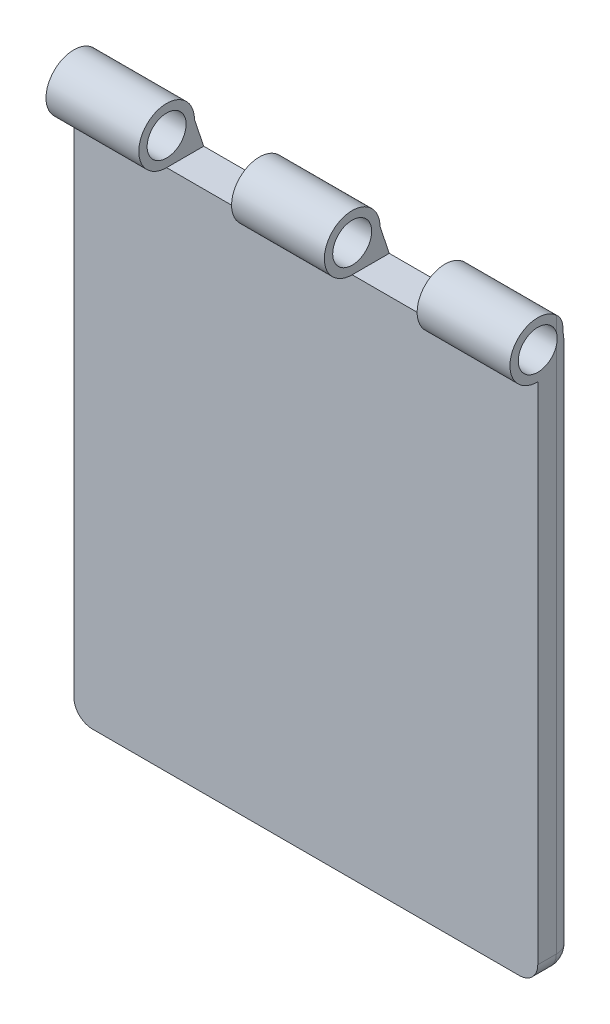
ISO-10303-21;
HEADER;
FILE_DESCRIPTION(('STEP AP214'),'2;1');
FILE_NAME('part.step','',(''),(''),'','','');
FILE_SCHEMA(('AUTOMOTIVE_DESIGN { 1 0 10303 214 1 1 1 1 }'));
ENDSEC;
DATA;
#1=APPLICATION_CONTEXT('core data for automotive mechanical design processes');
#2=APPLICATION_PROTOCOL_DEFINITION('international standard','automotive_design',2000,#1);
#3=PRODUCT_CONTEXT('',#1,'mechanical');
#4=PRODUCT('Part','Part','',(#3));
#5=PRODUCT_RELATED_PRODUCT_CATEGORY('part','',(#4));
#6=PRODUCT_DEFINITION_FORMATION('','',#4);
#7=PRODUCT_DEFINITION_CONTEXT('part definition',#1,'design');
#8=PRODUCT_DEFINITION('design','',#6,#7);
#9=PRODUCT_DEFINITION_SHAPE('','',#8);
#10=(LENGTH_UNIT() NAMED_UNIT(*) SI_UNIT(.MILLI.,.METRE.));
#11=(NAMED_UNIT(*) PLANE_ANGLE_UNIT() SI_UNIT($,.RADIAN.));
#12=(NAMED_UNIT(*) SI_UNIT($,.STERADIAN.) SOLID_ANGLE_UNIT());
#13=UNCERTAINTY_MEASURE_WITH_UNIT(LENGTH_MEASURE(1.E-05),#10,'distance_accuracy_value','');
#14=(GEOMETRIC_REPRESENTATION_CONTEXT(3) GLOBAL_UNCERTAINTY_ASSIGNED_CONTEXT((#13)) GLOBAL_UNIT_ASSIGNED_CONTEXT((#10,
#11,#12)) REPRESENTATION_CONTEXT('',''));
#15=CARTESIAN_POINT('',(0.,0.,0.));
#16=DIRECTION('',(0.,0.,1.));
#17=DIRECTION('',(1.,0.,0.));
#18=AXIS2_PLACEMENT_3D('',#15,#16,#17);
#19=CARTESIAN_POINT('',(-12.5,14.1,2.));
#20=DIRECTION('',(0.,-1.,0.));
#21=DIRECTION('',(0.,0.,-1.));
#22=AXIS2_PLACEMENT_3D('',#19,#20,#21);
#23=PLANE('',#22);
#24=DIRECTION('',(0.,0.,1.));
#25=VECTOR('',#24,1.);
#26=CARTESIAN_POINT('',(2.5,14.1,2.));
#27=LINE('',#26,#25);
#28=CARTESIAN_POINT('',(2.5,14.1,0.));
#29=VERTEX_POINT('',#28);
#30=CARTESIAN_POINT('',(2.5,14.1,2.));
#31=VERTEX_POINT('',#30);
#32=EDGE_CURVE('E185',#29,#31,#27,.T.);
#33=ORIENTED_EDGE('',*,*,#32,.T.);
#34=DIRECTION('',(-1.,0.,0.));
#35=VECTOR('',#34,1.);
#36=CARTESIAN_POINT('',(-12.5,14.1,2.));
#37=LINE('',#36,#35);
#38=CARTESIAN_POINT('',(7.5,14.1,2.));
#39=VERTEX_POINT('',#38);
#40=EDGE_CURVE('E275',#39,#31,#37,.T.);
#41=ORIENTED_EDGE('',*,*,#40,.F.);
#42=DIRECTION('',(0.,0.,1.));
#43=VECTOR('',#42,1.);
#44=CARTESIAN_POINT('',(7.5,14.1,2.));
#45=LINE('',#44,#43);
#46=CARTESIAN_POINT('',(7.5,14.1,0.));
#47=VERTEX_POINT('',#46);
#48=EDGE_CURVE('E224',#47,#39,#45,.T.);
#49=ORIENTED_EDGE('',*,*,#48,.F.);
#50=DIRECTION('',(-1.,0.,0.));
#51=VECTOR('',#50,1.);
#52=CARTESIAN_POINT('',(-12.5,14.1,0.));
#53=LINE('',#52,#51);
#54=EDGE_CURVE('E284',#47,#29,#53,.T.);
#55=ORIENTED_EDGE('',*,*,#54,.T.);
#56=EDGE_LOOP('',(#33,#41,#49,#55));
#57=FACE_BOUND('',#56,.T.);
#58=ADVANCED_FACE('F47',(#57),#23,.F.);
#59=CARTESIAN_POINT('',(-2.5,14.1,2.));
#60=VERTEX_POINT('',#59);
#61=CARTESIAN_POINT('',(-7.5,14.1,2.));
#62=VERTEX_POINT('',#61);
#63=EDGE_CURVE('E268',#60,#62,#37,.T.);
#64=ORIENTED_EDGE('',*,*,#63,.F.);
#65=DIRECTION('',(0.,0.,1.));
#66=VECTOR('',#65,1.);
#67=CARTESIAN_POINT('',(-2.5,14.1,2.));
#68=LINE('',#67,#66);
#69=CARTESIAN_POINT('',(-2.5,14.1,0.));
#70=VERTEX_POINT('',#69);
#71=EDGE_CURVE('E198',#70,#60,#68,.T.);
#72=ORIENTED_EDGE('',*,*,#71,.F.);
#73=CARTESIAN_POINT('',(-7.5,14.1,0.));
#74=VERTEX_POINT('',#73);
#75=EDGE_CURVE('E257',#70,#74,#53,.T.);
#76=ORIENTED_EDGE('',*,*,#75,.T.);
#77=DIRECTION('',(0.,0.,1.));
#78=VECTOR('',#77,1.);
#79=CARTESIAN_POINT('',(-7.5,14.1,2.));
#80=LINE('',#79,#78);
#81=EDGE_CURVE('E246',#74,#62,#80,.T.);
#82=ORIENTED_EDGE('',*,*,#81,.T.);
#83=EDGE_LOOP('',(#64,#72,#76,#82));
#84=FACE_BOUND('',#83,.T.);
#85=ADVANCED_FACE('F381',(#84),#23,.F.);
#86=CARTESIAN_POINT('',(12.5,-14.1,2.));
#87=DIRECTION('',(-1.,0.,0.));
#88=DIRECTION('',(0.,0.,1.));
#89=AXIS2_PLACEMENT_3D('',#86,#87,#88);
#90=PLANE('',#89);
#91=DIRECTION('',(0.,1.,0.));
#92=VECTOR('',#91,1.);
#93=CARTESIAN_POINT('',(12.5,-14.1,2.));
#94=LINE('',#93,#92);
#95=CARTESIAN_POINT('',(12.5,-13.1,2.));
#96=VERTEX_POINT('',#95);
#97=CARTESIAN_POINT('',(12.5,14.1,2.));
#98=VERTEX_POINT('',#97);
#99=EDGE_CURVE('E265',#96,#98,#94,.T.);
#100=ORIENTED_EDGE('',*,*,#99,.F.);
#101=DIRECTION('',(0.,0.,-1.));
#102=VECTOR('',#101,1.);
#103=CARTESIAN_POINT('',(12.5,-13.1,2.));
#104=LINE('',#103,#102);
#105=CARTESIAN_POINT('',(12.5,-13.1,1.));
#106=VERTEX_POINT('',#105);
#107=EDGE_CURVE('E474',#96,#106,#104,.T.);
#108=ORIENTED_EDGE('',*,*,#107,.T.);
#109=DIRECTION('',(0.,1.,0.));
#110=VECTOR('',#109,1.);
#111=CARTESIAN_POINT('',(12.5,14.1,1.));
#112=LINE('',#111,#110);
#113=CARTESIAN_POINT('',(12.5,15.2798436779322,1.));
#114=VERTEX_POINT('',#113);
#115=EDGE_CURVE('E293',#106,#114,#112,.T.);
#116=ORIENTED_EDGE('',*,*,#115,.T.);
#117=CARTESIAN_POINT('',(12.5,15.6,2.));
#118=DIRECTION('',(-1.,0.,0.));
#119=DIRECTION('',(0.,0.,1.));
#120=AXIS2_PLACEMENT_3D('',#117,#118,#119);
#121=CIRCLE('',#120,1.0500000336);
#122=CARTESIAN_POINT('',(12.5,15.9201563220678,1.));
#123=VERTEX_POINT('',#122);
#124=EDGE_CURVE('E290',#114,#123,#121,.T.);
#125=ORIENTED_EDGE('',*,*,#124,.T.);
#126=DIRECTION('',(0.,1.,0.));
#127=VECTOR('',#126,1.);
#128=CARTESIAN_POINT('',(12.5,14.1,1.));
#129=LINE('',#128,#127);
#130=CARTESIAN_POINT('',(12.5,16.7180339887499,0.999999999999999));
#131=VERTEX_POINT('',#130);
#132=EDGE_CURVE('E281',#123,#131,#129,.T.);
#133=ORIENTED_EDGE('',*,*,#132,.T.);
#134=CARTESIAN_POINT('',(12.5,15.6,2.));
#135=DIRECTION('',(-1.,0.,0.));
#136=DIRECTION('',(0.,0.,1.));
#137=AXIS2_PLACEMENT_3D('',#134,#135,#136);
#138=CIRCLE('',#137,1.5);
#139=EDGE_CURVE('E220',#98,#131,#138,.T.);
#140=ORIENTED_EDGE('',*,*,#139,.F.);
#141=EDGE_LOOP('',(#100,#108,#116,#125,#133,#140));
#142=FACE_BOUND('',#141,.T.);
#143=ADVANCED_FACE('F380',(#142),#90,.F.);
#144=CARTESIAN_POINT('',(-12.5,-14.1,2.));
#145=DIRECTION('',(1.,0.,0.));
#146=DIRECTION('',(0.,0.,-1.));
#147=AXIS2_PLACEMENT_3D('',#144,#145,#146);
#148=PLANE('',#147);
#149=DIRECTION('',(0.,-1.,0.));
#150=VECTOR('',#149,1.);
#151=CARTESIAN_POINT('',(-12.5,-14.1,1.));
#152=LINE('',#151,#150);
#153=CARTESIAN_POINT('',(-12.5,15.2798436779322,1.));
#154=VERTEX_POINT('',#153);
#155=CARTESIAN_POINT('',(-12.5,-13.1,1.));
#156=VERTEX_POINT('',#155);
#157=EDGE_CURVE('E421',#154,#156,#152,.T.);
#158=ORIENTED_EDGE('',*,*,#157,.T.);
#159=DIRECTION('',(0.,0.,-1.));
#160=VECTOR('',#159,1.);
#161=CARTESIAN_POINT('',(-12.5,-13.1,2.));
#162=LINE('',#161,#160);
#163=CARTESIAN_POINT('',(-12.5,-13.1,2.));
#164=VERTEX_POINT('',#163);
#165=EDGE_CURVE('E11',#156,#164,#162,.F.);
#166=ORIENTED_EDGE('',*,*,#165,.T.);
#167=DIRECTION('',(0.,-1.,0.));
#168=VECTOR('',#167,1.);
#169=CARTESIAN_POINT('',(-12.5,-14.1,2.));
#170=LINE('',#169,#168);
#171=CARTESIAN_POINT('',(-12.5,14.1,2.));
#172=VERTEX_POINT('',#171);
#173=EDGE_CURVE('E274',#172,#164,#170,.T.);
#174=ORIENTED_EDGE('',*,*,#173,.F.);
#175=CARTESIAN_POINT('',(-12.5,15.6,2.));
#176=DIRECTION('',(-1.,0.,0.));
#177=DIRECTION('',(0.,0.,1.));
#178=AXIS2_PLACEMENT_3D('',#175,#176,#177);
#179=CIRCLE('',#178,1.5);
#180=CARTESIAN_POINT('',(-12.5,16.7180339887499,0.999999999999999));
#181=VERTEX_POINT('',#180);
#182=EDGE_CURVE('E217',#172,#181,#179,.T.);
#183=ORIENTED_EDGE('',*,*,#182,.T.);
#184=DIRECTION('',(0.,-1.,0.));
#185=VECTOR('',#184,1.);
#186=CARTESIAN_POINT('',(-12.5,-14.1,1.));
#187=LINE('',#186,#185);
#188=CARTESIAN_POINT('',(-12.5,15.9201563220678,1.));
#189=VERTEX_POINT('',#188);
#190=EDGE_CURVE('E336',#181,#189,#187,.T.);
#191=ORIENTED_EDGE('',*,*,#190,.T.);
#192=CARTESIAN_POINT('',(-12.5,15.6,2.));
#193=DIRECTION('',(-1.,0.,0.));
#194=DIRECTION('',(0.,0.,1.));
#195=AXIS2_PLACEMENT_3D('',#192,#193,#194);
#196=CIRCLE('',#195,1.0500000336);
#197=EDGE_CURVE('E489',#154,#189,#196,.T.);
#198=ORIENTED_EDGE('',*,*,#197,.F.);
#199=EDGE_LOOP('',(#158,#166,#174,#183,#191,#198));
#200=FACE_BOUND('',#199,.T.);
#201=ADVANCED_FACE('F377',(#200),#148,.F.);
#202=CARTESIAN_POINT('',(-12.5,-14.1,2.));
#203=DIRECTION('',(0.,1.,0.));
#204=DIRECTION('',(0.,0.,1.));
#205=AXIS2_PLACEMENT_3D('',#202,#203,#204);
#206=PLANE('',#205);
#207=DIRECTION('',(1.,0.,0.));
#208=VECTOR('',#207,1.);
#209=CARTESIAN_POINT('',(12.5,-14.1,1.));
#210=LINE('',#209,#208);
#211=CARTESIAN_POINT('',(-11.5,-14.1,1.));
#212=VERTEX_POINT('',#211);
#213=CARTESIAN_POINT('',(11.5,-14.1,1.));
#214=VERTEX_POINT('',#213);
#215=EDGE_CURVE('E423',#212,#214,#210,.T.);
#216=ORIENTED_EDGE('',*,*,#215,.T.);
#217=DIRECTION('',(0.,0.,-1.));
#218=VECTOR('',#217,1.);
#219=CARTESIAN_POINT('',(11.5,-14.1,2.));
#220=LINE('',#219,#218);
#221=CARTESIAN_POINT('',(11.5,-14.1,2.));
#222=VERTEX_POINT('',#221);
#223=EDGE_CURVE('E71',#214,#222,#220,.F.);
#224=ORIENTED_EDGE('',*,*,#223,.T.);
#225=DIRECTION('',(1.,0.,0.));
#226=VECTOR('',#225,1.);
#227=CARTESIAN_POINT('',(-12.5,-14.1,2.));
#228=LINE('',#227,#226);
#229=CARTESIAN_POINT('',(-11.5,-14.1,2.));
#230=VERTEX_POINT('',#229);
#231=EDGE_CURVE('E278',#230,#222,#228,.T.);
#232=ORIENTED_EDGE('',*,*,#231,.F.);
#233=DIRECTION('',(0.,0.,-1.));
#234=VECTOR('',#233,1.);
#235=CARTESIAN_POINT('',(-11.5,-14.1,2.));
#236=LINE('',#235,#234);
#237=EDGE_CURVE('E477',#230,#212,#236,.T.);
#238=ORIENTED_EDGE('',*,*,#237,.T.);
#239=EDGE_LOOP('',(#216,#224,#232,#238));
#240=FACE_BOUND('',#239,.T.);
#241=ADVANCED_FACE('F370',(#240),#206,.F.);
#242=CARTESIAN_POINT('',(0.,0.,2.));
#243=DIRECTION('',(0.,0.,-1.));
#244=DIRECTION('',(-1.,0.,0.));
#245=AXIS2_PLACEMENT_3D('',#242,#243,#244);
#246=PLANE('',#245);
#247=ORIENTED_EDGE('',*,*,#231,.T.);
#248=CARTESIAN_POINT('',(11.5,-13.1,2.));
#249=DIRECTION('',(0.,0.,-1.));
#250=DIRECTION('',(-1.,0.,0.));
#251=AXIS2_PLACEMENT_3D('',#248,#249,#250);
#252=CIRCLE('',#251,1.);
#253=EDGE_CURVE('E57',#222,#96,#252,.F.);
#254=ORIENTED_EDGE('',*,*,#253,.T.);
#255=ORIENTED_EDGE('',*,*,#99,.T.);
#256=EDGE_CURVE('E270',#98,#39,#37,.T.);
#257=ORIENTED_EDGE('',*,*,#256,.T.);
#258=ORIENTED_EDGE('',*,*,#40,.T.);
#259=DIRECTION('',(-1.,0.,0.));
#260=VECTOR('',#259,1.);
#261=CARTESIAN_POINT('',(2.5,14.1,2.));
#262=LINE('',#261,#260);
#263=EDGE_CURVE('E196',#31,#60,#262,.T.);
#264=ORIENTED_EDGE('',*,*,#263,.T.);
#265=ORIENTED_EDGE('',*,*,#63,.T.);
#266=DIRECTION('',(-1.,0.,0.));
#267=VECTOR('',#266,1.);
#268=CARTESIAN_POINT('',(-7.5,14.1,2.));
#269=LINE('',#268,#267);
#270=EDGE_CURVE('E254',#62,#172,#269,.T.);
#271=ORIENTED_EDGE('',*,*,#270,.T.);
#272=ORIENTED_EDGE('',*,*,#173,.T.);
#273=CARTESIAN_POINT('',(-11.5,-13.1,2.));
#274=DIRECTION('',(0.,0.,-1.));
#275=DIRECTION('',(-1.,0.,0.));
#276=AXIS2_PLACEMENT_3D('',#273,#274,#275);
#277=CIRCLE('',#276,1.);
#278=EDGE_CURVE('E482',#164,#230,#277,.F.);
#279=ORIENTED_EDGE('',*,*,#278,.T.);
#280=EDGE_LOOP('',(#247,#254,#255,#257,#258,#264,#265,#271,#272,#279));
#281=FACE_BOUND('',#280,.T.);
#282=ADVANCED_FACE('F367',(#281),#246,.F.);
#283=CARTESIAN_POINT('',(0.,0.,0.));
#284=DIRECTION('',(0.,0.,-1.));
#285=DIRECTION('',(-1.,0.,0.));
#286=AXIS2_PLACEMENT_3D('',#283,#284,#285);
#287=PLANE('',#286);
#288=CARTESIAN_POINT('',(11.5,14.1,0.));
#289=VERTEX_POINT('',#288);
#290=EDGE_CURVE('E269',#289,#47,#53,.T.);
#291=ORIENTED_EDGE('',*,*,#290,.F.);
#292=DIRECTION('',(0.,1.,0.));
#293=VECTOR('',#292,1.);
#294=CARTESIAN_POINT('',(11.5,-14.1,0.));
#295=LINE('',#294,#293);
#296=CARTESIAN_POINT('',(11.5,-13.1,0.));
#297=VERTEX_POINT('',#296);
#298=EDGE_CURVE('E425',#289,#297,#295,.F.);
#299=ORIENTED_EDGE('',*,*,#298,.T.);
#300=DIRECTION('',(1.,0.,0.));
#301=VECTOR('',#300,1.);
#302=CARTESIAN_POINT('',(-12.5,-13.1,0.));
#303=LINE('',#302,#301);
#304=CARTESIAN_POINT('',(-11.5,-13.1,0.));
#305=VERTEX_POINT('',#304);
#306=EDGE_CURVE('E431',#297,#305,#303,.F.);
#307=ORIENTED_EDGE('',*,*,#306,.T.);
#308=DIRECTION('',(0.,-1.,0.));
#309=VECTOR('',#308,1.);
#310=CARTESIAN_POINT('',(-11.5,14.1,0.));
#311=LINE('',#310,#309);
#312=CARTESIAN_POINT('',(-11.5,14.1,0.));
#313=VERTEX_POINT('',#312);
#314=EDGE_CURVE('E435',#305,#313,#311,.F.);
#315=ORIENTED_EDGE('',*,*,#314,.T.);
#316=DIRECTION('',(-1.,0.,0.));
#317=VECTOR('',#316,1.);
#318=CARTESIAN_POINT('',(-7.5,14.1,0.));
#319=LINE('',#318,#317);
#320=EDGE_CURVE('E258',#74,#313,#319,.T.);
#321=ORIENTED_EDGE('',*,*,#320,.F.);
#322=ORIENTED_EDGE('',*,*,#75,.F.);
#323=DIRECTION('',(-1.,0.,0.));
#324=VECTOR('',#323,1.);
#325=CARTESIAN_POINT('',(2.5,14.1,0.));
#326=LINE('',#325,#324);
#327=EDGE_CURVE('E184',#29,#70,#326,.T.);
#328=ORIENTED_EDGE('',*,*,#327,.F.);
#329=ORIENTED_EDGE('',*,*,#54,.F.);
#330=EDGE_LOOP('',(#291,#299,#307,#315,#321,#322,#328,#329));
#331=FACE_BOUND('',#330,.T.);
#332=ADVANCED_FACE('F364',(#331),#287,.T.);
#333=CARTESIAN_POINT('',(-7.5,15.6,2.));
#334=DIRECTION('',(-1.,0.,0.));
#335=DIRECTION('',(0.,0.,1.));
#336=AXIS2_PLACEMENT_3D('',#333,#334,#335);
#337=CYLINDRICAL_SURFACE('',#336,1.5);
#338=DIRECTION('',(-1.,0.,0.));
#339=VECTOR('',#338,1.);
#340=CARTESIAN_POINT('',(-7.5,15.6,0.5));
#341=LINE('',#340,#339);
#342=CARTESIAN_POINT('',(-7.5,15.6,0.5));
#343=VERTEX_POINT('',#342);
#344=CARTESIAN_POINT('',(-12.3660254037844,15.6,0.5));
#345=VERTEX_POINT('',#344);
#346=EDGE_CURVE('E250',#343,#345,#341,.T.);
#347=ORIENTED_EDGE('',*,*,#346,.T.);
#348=CARTESIAN_POINT('',(-12.3660254037844,15.6,0.5));
#349=CARTESIAN_POINT('',(-12.3659900406237,15.6427836946923,0.499990971237235));
#350=CARTESIAN_POINT('',(-12.3670816521528,15.6855514803416,0.501829962877997));
#351=CARTESIAN_POINT('',(-12.3712498441526,15.7706309873444,0.509128290459549));
#352=CARTESIAN_POINT('',(-12.3743240811284,15.8129431872524,0.514583352359285));
#353=CARTESIAN_POINT('',(-12.3821794747471,15.8966807876489,0.529019616788975));
#354=CARTESIAN_POINT('',(-12.3869561640598,15.9381082110962,0.537991596822342));
#355=CARTESIAN_POINT('',(-12.3977592646689,16.0199013720734,0.559350746418624));
#356=CARTESIAN_POINT('',(-12.40378592864,16.0602668930845,0.571738606647507));
#357=CARTESIAN_POINT('',(-12.4217747995455,16.1720555901174,0.611262037942825));
#358=CARTESIAN_POINT('',(-12.4345772703245,16.2420313310325,0.642196860097189));
#359=CARTESIAN_POINT('',(-12.459093738391,16.3765049389855,0.714366953760678));
#360=CARTESIAN_POINT('',(-12.4708097069588,16.4410127077207,0.755583049349835));
#361=CARTESIAN_POINT('',(-12.4860589741396,16.5411031034082,0.830944695450385));
#362=CARTESIAN_POINT('',(-12.4910182500758,16.5786574495425,0.862190239230773));
#363=CARTESIAN_POINT('',(-12.4979872095065,16.6507408740002,0.928388460597863));
#364=CARTESIAN_POINT('',(-12.4999920496406,16.6852648976377,0.963347124961958));
#365=CARTESIAN_POINT('',(-12.5,16.7180339887499,1.));
#366=B_SPLINE_CURVE_WITH_KNOTS('',3,(#348,#349,#350,#351,#352,#353,#354,#355,#356,#357,#358,
#359,#360,#361,#362,#363,#364,#365),.UNSPECIFIED.,.F.,.F.,(4,2,2,2,2,2,2,2,4),(0.,
0.12827202163761,0.256392700898055,0.384179630040103,0.511992415733351,0.743779618210432,
0.975137698021794,1.12215327624229,1.26940959768342),.UNSPECIFIED.);
#367=EDGE_CURVE('E348',#345,#181,#366,.T.);
#368=ORIENTED_EDGE('',*,*,#367,.T.);
#369=ORIENTED_EDGE('',*,*,#182,.F.);
#370=ORIENTED_EDGE('',*,*,#270,.F.);
#371=CARTESIAN_POINT('',(-7.5,15.6,2.));
#372=DIRECTION('',(-1.,0.,0.));
#373=DIRECTION('',(0.,0.,1.));
#374=AXIS2_PLACEMENT_3D('',#371,#372,#373);
#375=CIRCLE('',#374,1.5);
#376=EDGE_CURVE('E238',#62,#343,#375,.T.);
#377=ORIENTED_EDGE('',*,*,#376,.T.);
#378=EDGE_LOOP('',(#347,#368,#369,#370,#377));
#379=FACE_BOUND('',#378,.T.);
#380=ADVANCED_FACE('F358',(#379),#337,.T.);
#381=CARTESIAN_POINT('',(-7.5,15.6,0.5));
#382=DIRECTION('',(0.,0.316227766016838,-0.948683298050514));
#383=DIRECTION('',(0.,0.948683298050514,0.316227766016838));
#384=AXIS2_PLACEMENT_3D('',#381,#382,#383);
#385=PLANE('',#384);
#386=ORIENTED_EDGE('',*,*,#320,.T.);
#387=CARTESIAN_POINT('',(-11.5,17.1,1.));
#388=DIRECTION('',(0.,0.316227766016838,-0.948683298050514));
#389=DIRECTION('',(0.,0.948683298050514,0.316227766016838));
#390=AXIS2_PLACEMENT_3D('',#387,#388,#389);
#391=ELLIPSE('',#390,3.16227766016838,1.);
#392=EDGE_CURVE('E335',#313,#345,#391,.T.);
#393=ORIENTED_EDGE('',*,*,#392,.T.);
#394=ORIENTED_EDGE('',*,*,#346,.F.);
#395=DIRECTION('',(0.,-0.948683298050514,-0.316227766016838));
#396=VECTOR('',#395,1.);
#397=CARTESIAN_POINT('',(-7.5,15.6,0.5));
#398=LINE('',#397,#396);
#399=EDGE_CURVE('E242',#343,#74,#398,.T.);
#400=ORIENTED_EDGE('',*,*,#399,.T.);
#401=EDGE_LOOP('',(#386,#393,#394,#400));
#402=FACE_BOUND('',#401,.T.);
#403=ADVANCED_FACE('F363',(#402),#385,.T.);
#404=CARTESIAN_POINT('',(-7.5,15.6,2.));
#405=DIRECTION('',(-1.,0.,0.));
#406=DIRECTION('',(0.,0.,1.));
#407=AXIS2_PLACEMENT_3D('',#404,#405,#406);
#408=PLANE('',#407);
#409=CARTESIAN_POINT('',(-7.5,15.6,2.));
#410=DIRECTION('',(-1.,0.,0.));
#411=DIRECTION('',(0.,0.,1.));
#412=AXIS2_PLACEMENT_3D('',#409,#410,#411);
#413=CIRCLE('',#412,1.0500000336);
#414=CARTESIAN_POINT('',(-7.5,15.6,3.0500000336));
#415=VERTEX_POINT('',#414);
#416=EDGE_CURVE('E204',#415,#415,#413,.T.);
#417=ORIENTED_EDGE('',*,*,#416,.T.);
#418=EDGE_LOOP('',(#417));
#419=FACE_BOUND('',#418,.T.);
#420=ORIENTED_EDGE('',*,*,#376,.F.);
#421=ORIENTED_EDGE('',*,*,#81,.F.);
#422=ORIENTED_EDGE('',*,*,#399,.F.);
#423=EDGE_LOOP('',(#420,#421,#422));
#424=FACE_BOUND('',#423,.T.);
#425=ADVANCED_FACE('F410',(#419,#424),#408,.F.);
#426=CARTESIAN_POINT('',(12.5,15.6,2.));
#427=DIRECTION('',(-1.,0.,0.));
#428=DIRECTION('',(0.,0.,1.));
#429=AXIS2_PLACEMENT_3D('',#426,#427,#428);
#430=CYLINDRICAL_SURFACE('',#429,1.5);
#431=ORIENTED_EDGE('',*,*,#139,.T.);
#432=CARTESIAN_POINT('',(12.5,16.7180339887499,1.));
#433=CARTESIAN_POINT('',(12.4999954476552,16.6894669200162,0.968054317710801));
#434=CARTESIAN_POINT('',(12.4984705598611,16.6595685877876,0.937388974298558));
#435=CARTESIAN_POINT('',(12.4930705097883,16.5974279417377,0.878860744005511));
#436=CARTESIAN_POINT('',(12.4891993615022,16.5651897137518,0.850993165399178));
#437=CARTESIAN_POINT('',(12.4751071006692,16.4654157077494,0.771892626053745));
#438=CARTESIAN_POINT('',(12.4624018872437,16.3947091330876,0.725038080616293));
#439=CARTESIAN_POINT('',(12.4368593253114,16.254502030219,0.648203514920105));
#440=CARTESIAN_POINT('',(12.4241732109535,16.1856411883065,0.61697513657016));
#441=CARTESIAN_POINT('',(12.4009590870442,16.0437640295181,0.565166633752));
#442=CARTESIAN_POINT('',(12.3904263664338,15.9707572402198,0.544563111126349));
#443=CARTESIAN_POINT('',(12.3772255451147,15.8478436578497,0.519789032811216));
#444=CARTESIAN_POINT('',(12.3730963273239,15.7987283649129,0.512395817296737));
#445=CARTESIAN_POINT('',(12.3674640302886,15.6997588175263,0.502490206571678));
#446=CARTESIAN_POINT('',(12.3659665180522,15.6499032210313,0.499988156691442));
#447=CARTESIAN_POINT('',(12.3660254037844,15.6,0.5));
#448=B_SPLINE_CURVE_WITH_KNOTS('',3,(#432,#433,#434,#435,#436,#437,#438,#439,#440,#441,#442,
#443,#444,#445,#446,#447),.UNSPECIFIED.,.F.,.F.,(4,2,2,2,2,2,2,4),(0.,0.128393680819727,
0.256568322771629,0.512425845906303,0.741667501327363,0.970402139236489,1.11962896422542,
1.2691710796134),.UNSPECIFIED.);
#449=CARTESIAN_POINT('',(12.3660254037844,15.6,0.5));
#450=VERTEX_POINT('',#449);
#451=EDGE_CURVE('E305',#131,#450,#448,.T.);
#452=ORIENTED_EDGE('',*,*,#451,.T.);
#453=DIRECTION('',(-1.,0.,0.));
#454=VECTOR('',#453,1.);
#455=CARTESIAN_POINT('',(12.5,15.6,0.5));
#456=LINE('',#455,#454);
#457=CARTESIAN_POINT('',(7.5,15.6,0.5));
#458=VERTEX_POINT('',#457);
#459=EDGE_CURVE('E212',#450,#458,#456,.T.);
#460=ORIENTED_EDGE('',*,*,#459,.T.);
#461=CARTESIAN_POINT('',(7.5,15.6,2.));
#462=DIRECTION('',(-1.,0.,0.));
#463=DIRECTION('',(0.,0.,1.));
#464=AXIS2_PLACEMENT_3D('',#461,#462,#463);
#465=CIRCLE('',#464,1.5);
#466=EDGE_CURVE('E225',#39,#458,#465,.T.);
#467=ORIENTED_EDGE('',*,*,#466,.F.);
#468=ORIENTED_EDGE('',*,*,#256,.F.);
#469=EDGE_LOOP('',(#431,#452,#460,#467,#468));
#470=FACE_BOUND('',#469,.T.);
#471=ADVANCED_FACE('F446',(#470),#430,.T.);
#472=CARTESIAN_POINT('',(12.5,15.6,0.5));
#473=DIRECTION('',(0.,0.316227766016838,-0.948683298050514));
#474=DIRECTION('',(0.,0.948683298050514,0.316227766016838));
#475=AXIS2_PLACEMENT_3D('',#472,#473,#474);
#476=PLANE('',#475);
#477=ORIENTED_EDGE('',*,*,#459,.F.);
#478=CARTESIAN_POINT('',(11.5,17.1,1.));
#479=DIRECTION('',(0.,0.316227766016838,-0.948683298050514));
#480=DIRECTION('',(0.,-0.948683298050514,-0.316227766016838));
#481=AXIS2_PLACEMENT_3D('',#478,#479,#480);
#482=ELLIPSE('',#481,3.16227766016838,1.);
#483=EDGE_CURVE('E437',#450,#289,#482,.T.);
#484=ORIENTED_EDGE('',*,*,#483,.T.);
#485=ORIENTED_EDGE('',*,*,#290,.T.);
#486=DIRECTION('',(0.,-0.948683298050514,-0.316227766016838));
#487=VECTOR('',#486,1.);
#488=CARTESIAN_POINT('',(7.5,15.6,0.5));
#489=LINE('',#488,#487);
#490=EDGE_CURVE('E229',#458,#47,#489,.T.);
#491=ORIENTED_EDGE('',*,*,#490,.F.);
#492=EDGE_LOOP('',(#477,#484,#485,#491));
#493=FACE_BOUND('',#492,.T.);
#494=ADVANCED_FACE('F451',(#493),#476,.T.);
#495=CARTESIAN_POINT('',(7.5,15.6,2.));
#496=DIRECTION('',(-1.,0.,0.));
#497=DIRECTION('',(0.,0.,1.));
#498=AXIS2_PLACEMENT_3D('',#495,#496,#497);
#499=PLANE('',#498);
#500=CARTESIAN_POINT('',(7.5,15.6,2.));
#501=DIRECTION('',(-1.,0.,0.));
#502=DIRECTION('',(0.,0.,1.));
#503=AXIS2_PLACEMENT_3D('',#500,#501,#502);
#504=CIRCLE('',#503,1.0500000336);
#505=CARTESIAN_POINT('',(7.5,15.6,3.0500000336));
#506=VERTEX_POINT('',#505);
#507=EDGE_CURVE('E512',#506,#506,#504,.T.);
#508=ORIENTED_EDGE('',*,*,#507,.F.);
#509=EDGE_LOOP('',(#508));
#510=FACE_BOUND('',#509,.T.);
#511=ORIENTED_EDGE('',*,*,#466,.T.);
#512=ORIENTED_EDGE('',*,*,#490,.T.);
#513=ORIENTED_EDGE('',*,*,#48,.T.);
#514=EDGE_LOOP('',(#511,#512,#513));
#515=FACE_BOUND('',#514,.T.);
#516=ADVANCED_FACE('F545',(#510,#515),#499,.T.);
#517=CARTESIAN_POINT('',(2.5,15.6,2.));
#518=DIRECTION('',(-1.,0.,0.));
#519=DIRECTION('',(0.,0.,1.));
#520=AXIS2_PLACEMENT_3D('',#517,#518,#519);
#521=CYLINDRICAL_SURFACE('',#520,1.5);
#522=CARTESIAN_POINT('',(-2.5,15.6,2.));
#523=DIRECTION('',(-1.,0.,0.));
#524=DIRECTION('',(0.,0.,1.));
#525=AXIS2_PLACEMENT_3D('',#522,#523,#524);
#526=CIRCLE('',#525,1.5);
#527=CARTESIAN_POINT('',(-2.5,15.6,0.5));
#528=VERTEX_POINT('',#527);
#529=EDGE_CURVE('E209',#60,#528,#526,.T.);
#530=ORIENTED_EDGE('',*,*,#529,.F.);
#531=ORIENTED_EDGE('',*,*,#263,.F.);
#532=CARTESIAN_POINT('',(2.5,15.6,2.));
#533=DIRECTION('',(-1.,0.,0.));
#534=DIRECTION('',(0.,0.,1.));
#535=AXIS2_PLACEMENT_3D('',#532,#533,#534);
#536=CIRCLE('',#535,1.5);
#537=CARTESIAN_POINT('',(2.5,15.6,0.5));
#538=VERTEX_POINT('',#537);
#539=EDGE_CURVE('E190',#31,#538,#536,.T.);
#540=ORIENTED_EDGE('',*,*,#539,.T.);
#541=DIRECTION('',(-1.,0.,0.));
#542=VECTOR('',#541,1.);
#543=CARTESIAN_POINT('',(2.5,15.6,0.5));
#544=LINE('',#543,#542);
#545=EDGE_CURVE('E171',#538,#528,#544,.T.);
#546=ORIENTED_EDGE('',*,*,#545,.T.);
#547=EDGE_LOOP('',(#530,#531,#540,#546));
#548=FACE_BOUND('',#547,.T.);
#549=ADVANCED_FACE('F194',(#548),#521,.T.);
#550=CARTESIAN_POINT('',(2.5,15.6,0.5));
#551=DIRECTION('',(0.,0.316227766016838,-0.948683298050514));
#552=DIRECTION('',(0.,0.948683298050514,0.316227766016838));
#553=AXIS2_PLACEMENT_3D('',#550,#551,#552);
#554=PLANE('',#553);
#555=DIRECTION('',(0.,-0.948683298050514,-0.316227766016838));
#556=VECTOR('',#555,1.);
#557=CARTESIAN_POINT('',(-2.5,15.6,0.5));
#558=LINE('',#557,#556);
#559=EDGE_CURVE('E178',#528,#70,#558,.T.);
#560=ORIENTED_EDGE('',*,*,#559,.F.);
#561=ORIENTED_EDGE('',*,*,#545,.F.);
#562=DIRECTION('',(0.,-0.948683298050514,-0.316227766016838));
#563=VECTOR('',#562,1.);
#564=CARTESIAN_POINT('',(2.5,15.6,0.5));
#565=LINE('',#564,#563);
#566=EDGE_CURVE('E175',#538,#29,#565,.T.);
#567=ORIENTED_EDGE('',*,*,#566,.T.);
#568=ORIENTED_EDGE('',*,*,#327,.T.);
#569=EDGE_LOOP('',(#560,#561,#567,#568));
#570=FACE_BOUND('',#569,.T.);
#571=ADVANCED_FACE('F173',(#570),#554,.T.);
#572=CARTESIAN_POINT('',(2.5,15.6,2.));
#573=DIRECTION('',(-1.,0.,0.));
#574=DIRECTION('',(0.,0.,1.));
#575=AXIS2_PLACEMENT_3D('',#572,#573,#574);
#576=PLANE('',#575);
#577=CARTESIAN_POINT('',(2.5,15.6,2.));
#578=DIRECTION('',(-1.,0.,0.));
#579=DIRECTION('',(0.,0.,1.));
#580=AXIS2_PLACEMENT_3D('',#577,#578,#579);
#581=CIRCLE('',#580,1.0500000336);
#582=CARTESIAN_POINT('',(2.5,15.6,3.0500000336));
#583=VERTEX_POINT('',#582);
#584=EDGE_CURVE('E289',#583,#583,#581,.T.);
#585=ORIENTED_EDGE('',*,*,#584,.T.);
#586=EDGE_LOOP('',(#585));
#587=FACE_BOUND('',#586,.T.);
#588=ORIENTED_EDGE('',*,*,#539,.F.);
#589=ORIENTED_EDGE('',*,*,#32,.F.);
#590=ORIENTED_EDGE('',*,*,#566,.F.);
#591=EDGE_LOOP('',(#588,#589,#590));
#592=FACE_BOUND('',#591,.T.);
#593=ADVANCED_FACE('F189',(#587,#592),#576,.F.);
#594=CARTESIAN_POINT('',(-2.5,15.6,2.));
#595=DIRECTION('',(-1.,0.,0.));
#596=DIRECTION('',(0.,0.,1.));
#597=AXIS2_PLACEMENT_3D('',#594,#595,#596);
#598=PLANE('',#597);
#599=CARTESIAN_POINT('',(-2.5,15.6,2.));
#600=DIRECTION('',(-1.,0.,0.));
#601=DIRECTION('',(0.,0.,1.));
#602=AXIS2_PLACEMENT_3D('',#599,#600,#601);
#603=CIRCLE('',#602,1.0500000336);
#604=CARTESIAN_POINT('',(-2.5,15.6,3.0500000336));
#605=VERTEX_POINT('',#604);
#606=EDGE_CURVE('E285',#605,#605,#603,.T.);
#607=ORIENTED_EDGE('',*,*,#606,.F.);
#608=EDGE_LOOP('',(#607));
#609=FACE_BOUND('',#608,.T.);
#610=ORIENTED_EDGE('',*,*,#529,.T.);
#611=ORIENTED_EDGE('',*,*,#559,.T.);
#612=ORIENTED_EDGE('',*,*,#71,.T.);
#613=EDGE_LOOP('',(#610,#611,#612));
#614=FACE_BOUND('',#613,.T.);
#615=ADVANCED_FACE('F525',(#609,#614),#598,.T.);
#616=CARTESIAN_POINT('',(12.5,15.6,2.));
#617=DIRECTION('',(-1.,0.,0.));
#618=DIRECTION('',(0.,0.,1.));
#619=AXIS2_PLACEMENT_3D('',#616,#617,#618);
#620=CYLINDRICAL_SURFACE('',#619,1.0500000336);
#621=ORIENTED_EDGE('',*,*,#606,.T.);
#622=EDGE_LOOP('',(#621));
#623=FACE_BOUND('',#622,.T.);
#624=ORIENTED_EDGE('',*,*,#584,.F.);
#625=EDGE_LOOP('',(#624));
#626=FACE_BOUND('',#625,.T.);
#627=ADVANCED_FACE('F321',(#623,#626),#620,.F.);
#628=ORIENTED_EDGE('',*,*,#507,.T.);
#629=EDGE_LOOP('',(#628));
#630=FACE_BOUND('',#629,.T.);
#631=ORIENTED_EDGE('',*,*,#124,.F.);
#632=CARTESIAN_POINT('',(12.5,15.2798436779322,1.));
#633=CARTESIAN_POINT('',(12.4999907806285,15.3083145344401,0.990881686508894));
#634=CARTESIAN_POINT('',(12.499874920128,15.3371751107758,0.982985538061946));
#635=CARTESIAN_POINT('',(12.4995648808249,15.3954655670102,0.969680696771725));
#636=CARTESIAN_POINT('',(12.4993706973578,15.4248954807168,0.964272152120655));
#637=CARTESIAN_POINT('',(12.4990432226678,15.4833588361902,0.956091987644991));
#638=CARTESIAN_POINT('',(12.4989085097862,15.5123833554146,0.95325686656523));
#639=CARTESIAN_POINT('',(12.4987507128627,15.5705557149556,0.950008285947679));
#640=CARTESIAN_POINT('',(12.4987276090851,15.5997035325567,0.94959439825981));
#641=CARTESIAN_POINT('',(12.4988383048598,15.6776829101915,0.951740061441472));
#642=CARTESIAN_POINT('',(12.4990889392997,15.7264787394977,0.95650274385998));
#643=CARTESIAN_POINT('',(12.4995201261258,15.7992980715856,0.968783841440515));
#644=CARTESIAN_POINT('',(12.4996750559619,15.8237722843677,0.973817510034497));
#645=CARTESIAN_POINT('',(12.4999135041842,15.8723035125674,0.985616616073079));
#646=CARTESIAN_POINT('',(12.4999970128476,15.8963604707452,0.992382289141567));
#647=CARTESIAN_POINT('',(12.5,15.9201563220678,0.999999999999999));
#648=B_SPLINE_CURVE_WITH_KNOTS('',3,(#632,#633,#634,#635,#636,#637,#638,#639,#640,#641,#642,
#643,#644,#645,#646,#647),.UNSPECIFIED.,.F.,.F.,(4,2,2,2,2,2,2,4),(0.,0.0896563058431477,
0.179317952024346,0.266701708763339,0.354070012843519,0.500596966177744,0.575505134728575,
0.650423499293523),.UNSPECIFIED.);
#649=EDGE_CURVE('E296',#114,#123,#648,.T.);
#650=ORIENTED_EDGE('',*,*,#649,.T.);
#651=EDGE_LOOP('',(#631,#650));
#652=FACE_BOUND('',#651,.T.);
#653=ADVANCED_FACE('F316',(#630,#652),#620,.F.);
#654=ORIENTED_EDGE('',*,*,#197,.T.);
#655=CARTESIAN_POINT('',(-12.5,15.9201563220678,1.));
#656=CARTESIAN_POINT('',(-12.4999907806285,15.8916854655599,0.990881686508893));
#657=CARTESIAN_POINT('',(-12.499874920128,15.8628248892242,0.982985538061945));
#658=CARTESIAN_POINT('',(-12.4995648808249,15.8045344329898,0.969680696771724));
#659=CARTESIAN_POINT('',(-12.4993706973578,15.7751045192832,0.964272152120655));
#660=CARTESIAN_POINT('',(-12.4990432226678,15.7166411638098,0.956091987644991));
#661=CARTESIAN_POINT('',(-12.4989085097862,15.6876166445854,0.95325686656523));
#662=CARTESIAN_POINT('',(-12.4987507128628,15.6294442850444,0.950008285947679));
#663=CARTESIAN_POINT('',(-12.4987276090851,15.6002964674433,0.94959439825981));
#664=CARTESIAN_POINT('',(-12.4988383048598,15.5223170898085,0.951740061441472));
#665=CARTESIAN_POINT('',(-12.4990889392997,15.4735212605023,0.956502743859979));
#666=CARTESIAN_POINT('',(-12.4995201261258,15.4007019284144,0.968783841440515));
#667=CARTESIAN_POINT('',(-12.4996750559619,15.3762277156323,0.973817510034497));
#668=CARTESIAN_POINT('',(-12.4999135041843,15.3276964874326,0.98561661607308));
#669=CARTESIAN_POINT('',(-12.4999970128476,15.3036395292548,0.992382289141568));
#670=CARTESIAN_POINT('',(-12.5,15.2798436779322,1.));
#671=B_SPLINE_CURVE_WITH_KNOTS('',3,(#655,#656,#657,#658,#659,#660,#661,#662,#663,#664,#665,
#666,#667,#668,#669,#670),.UNSPECIFIED.,.F.,.F.,(4,2,2,2,2,2,2,4),(0.,0.0896563058431498,
0.179317952024346,0.266701708763341,0.354070012843517,0.500596966177744,0.575505134728572,
0.650423499293526),.UNSPECIFIED.);
#672=EDGE_CURVE('E326',#189,#154,#671,.T.);
#673=ORIENTED_EDGE('',*,*,#672,.T.);
#674=EDGE_LOOP('',(#654,#673));
#675=FACE_BOUND('',#674,.T.);
#676=ORIENTED_EDGE('',*,*,#416,.F.);
#677=EDGE_LOOP('',(#676));
#678=FACE_BOUND('',#677,.T.);
#679=ADVANCED_FACE('F320',(#675,#678),#620,.F.);
#680=CARTESIAN_POINT('',(-11.5,-14.1,1.));
#681=DIRECTION('',(0.,1.,0.));
#682=DIRECTION('',(0.,0.,1.));
#683=AXIS2_PLACEMENT_3D('',#680,#681,#682);
#684=CYLINDRICAL_SURFACE('',#683,1.);
#685=ORIENTED_EDGE('',*,*,#314,.F.);
#686=CARTESIAN_POINT('',(-11.5,-13.1,1.));
#687=DIRECTION('',(0.,1.,0.));
#688=DIRECTION('',(0.,0.,1.));
#689=AXIS2_PLACEMENT_3D('',#686,#687,#688);
#690=CIRCLE('',#689,1.);
#691=EDGE_CURVE('E469',#305,#156,#690,.T.);
#692=ORIENTED_EDGE('',*,*,#691,.T.);
#693=ORIENTED_EDGE('',*,*,#157,.F.);
#694=ORIENTED_EDGE('',*,*,#672,.F.);
#695=ORIENTED_EDGE('',*,*,#190,.F.);
#696=ORIENTED_EDGE('',*,*,#367,.F.);
#697=ORIENTED_EDGE('',*,*,#392,.F.);
#698=EDGE_LOOP('',(#685,#692,#693,#694,#695,#696,#697));
#699=FACE_BOUND('',#698,.T.);
#700=ADVANCED_FACE('F339',(#699),#684,.T.);
#701=CARTESIAN_POINT('',(-12.5,-13.1,1.));
#702=DIRECTION('',(-1.,0.,0.));
#703=DIRECTION('',(0.,0.,1.));
#704=AXIS2_PLACEMENT_3D('',#701,#702,#703);
#705=CYLINDRICAL_SURFACE('',#704,1.);
#706=ORIENTED_EDGE('',*,*,#306,.F.);
#707=CARTESIAN_POINT('',(11.5,-13.1,1.));
#708=DIRECTION('',(-1.,0.,0.));
#709=DIRECTION('',(0.,0.,1.));
#710=AXIS2_PLACEMENT_3D('',#707,#708,#709);
#711=CIRCLE('',#710,1.);
#712=EDGE_CURVE('E460',#297,#214,#711,.T.);
#713=ORIENTED_EDGE('',*,*,#712,.T.);
#714=ORIENTED_EDGE('',*,*,#215,.F.);
#715=CARTESIAN_POINT('',(-11.5,-13.1,1.));
#716=DIRECTION('',(-1.,0.,0.));
#717=DIRECTION('',(0.,0.,1.));
#718=AXIS2_PLACEMENT_3D('',#715,#716,#717);
#719=CIRCLE('',#718,1.);
#720=EDGE_CURVE('E462',#212,#305,#719,.F.);
#721=ORIENTED_EDGE('',*,*,#720,.T.);
#722=EDGE_LOOP('',(#706,#713,#714,#721));
#723=FACE_BOUND('',#722,.T.);
#724=ADVANCED_FACE('F343',(#723),#705,.T.);
#725=CARTESIAN_POINT('',(11.5,-14.1,1.));
#726=DIRECTION('',(0.,-1.,0.));
#727=DIRECTION('',(0.,0.,-1.));
#728=AXIS2_PLACEMENT_3D('',#725,#726,#727);
#729=CYLINDRICAL_SURFACE('',#728,1.);
#730=ORIENTED_EDGE('',*,*,#115,.F.);
#731=CARTESIAN_POINT('',(11.5,-13.1,1.));
#732=DIRECTION('',(0.,-1.,0.));
#733=DIRECTION('',(0.,0.,-1.));
#734=AXIS2_PLACEMENT_3D('',#731,#732,#733);
#735=CIRCLE('',#734,1.);
#736=EDGE_CURVE('E356',#106,#297,#735,.F.);
#737=ORIENTED_EDGE('',*,*,#736,.T.);
#738=ORIENTED_EDGE('',*,*,#298,.F.);
#739=ORIENTED_EDGE('',*,*,#483,.F.);
#740=ORIENTED_EDGE('',*,*,#451,.F.);
#741=ORIENTED_EDGE('',*,*,#132,.F.);
#742=ORIENTED_EDGE('',*,*,#649,.F.);
#743=EDGE_LOOP('',(#730,#737,#738,#739,#740,#741,#742));
#744=FACE_BOUND('',#743,.T.);
#745=ADVANCED_FACE('F312',(#744),#729,.T.);
#746=CARTESIAN_POINT('',(11.5,-13.1,2.));
#747=DIRECTION('',(0.,0.,-1.));
#748=DIRECTION('',(-1.,0.,0.));
#749=AXIS2_PLACEMENT_3D('',#746,#747,#748);
#750=CYLINDRICAL_SURFACE('',#749,1.);
#751=ORIENTED_EDGE('',*,*,#253,.F.);
#752=ORIENTED_EDGE('',*,*,#223,.F.);
#753=CARTESIAN_POINT('',(11.5,-13.1,1.));
#754=DIRECTION('',(0.,0.,-1.));
#755=DIRECTION('',(-1.,0.,0.));
#756=AXIS2_PLACEMENT_3D('',#753,#754,#755);
#757=CIRCLE('',#756,1.);
#758=EDGE_CURVE('E486',#106,#214,#757,.T.);
#759=ORIENTED_EDGE('',*,*,#758,.F.);
#760=ORIENTED_EDGE('',*,*,#107,.F.);
#761=EDGE_LOOP('',(#751,#752,#759,#760));
#762=FACE_BOUND('',#761,.T.);
#763=ADVANCED_FACE('F501',(#762),#750,.T.);
#764=CARTESIAN_POINT('',(11.5,-13.1,1.));
#765=DIRECTION('',(0.,0.,1.));
#766=DIRECTION('',(1.,0.,0.));
#767=AXIS2_PLACEMENT_3D('',#764,#765,#766);
#768=SPHERICAL_SURFACE('',#767,1.);
#769=ORIENTED_EDGE('',*,*,#758,.T.);
#770=ORIENTED_EDGE('',*,*,#712,.F.);
#771=ORIENTED_EDGE('',*,*,#736,.F.);
#772=EDGE_LOOP('',(#769,#770,#771));
#773=FACE_BOUND('',#772,.T.);
#774=ADVANCED_FACE('F345',(#773),#768,.T.);
#775=CARTESIAN_POINT('',(-11.5,-13.1,2.));
#776=DIRECTION('',(0.,0.,-1.));
#777=DIRECTION('',(-1.,0.,0.));
#778=AXIS2_PLACEMENT_3D('',#775,#776,#777);
#779=CYLINDRICAL_SURFACE('',#778,1.);
#780=ORIENTED_EDGE('',*,*,#278,.F.);
#781=ORIENTED_EDGE('',*,*,#165,.F.);
#782=CARTESIAN_POINT('',(-11.5,-13.1,1.));
#783=DIRECTION('',(0.,0.,-1.));
#784=DIRECTION('',(-1.,0.,0.));
#785=AXIS2_PLACEMENT_3D('',#782,#783,#784);
#786=CIRCLE('',#785,1.);
#787=EDGE_CURVE('E51',#212,#156,#786,.T.);
#788=ORIENTED_EDGE('',*,*,#787,.F.);
#789=ORIENTED_EDGE('',*,*,#237,.F.);
#790=EDGE_LOOP('',(#780,#781,#788,#789));
#791=FACE_BOUND('',#790,.T.);
#792=ADVANCED_FACE('F49',(#791),#779,.T.);
#793=CARTESIAN_POINT('',(-11.5,-13.1,1.));
#794=DIRECTION('',(0.,0.,1.));
#795=DIRECTION('',(1.,0.,0.));
#796=AXIS2_PLACEMENT_3D('',#793,#794,#795);
#797=SPHERICAL_SURFACE('',#796,1.);
#798=ORIENTED_EDGE('',*,*,#787,.T.);
#799=ORIENTED_EDGE('',*,*,#691,.F.);
#800=ORIENTED_EDGE('',*,*,#720,.F.);
#801=EDGE_LOOP('',(#798,#799,#800));
#802=FACE_BOUND('',#801,.T.);
#803=ADVANCED_FACE('F495',(#802),#797,.T.);
#804=CLOSED_SHELL('',(#58,#85,#143,#201,#241,#282,#332,#380,#403,#425,#471,#494,#516,#549,#571,
#593,#615,#627,#653,#679,#700,#724,#745,#763,#774,#792,#803));
#805=MANIFOLD_SOLID_BREP('B2',#804);
#806=ADVANCED_BREP_SHAPE_REPRESENTATION('',(#18,#805),#14);
#807=SHAPE_DEFINITION_REPRESENTATION(#9,#806);
ENDSEC;
END-ISO-10303-21;
